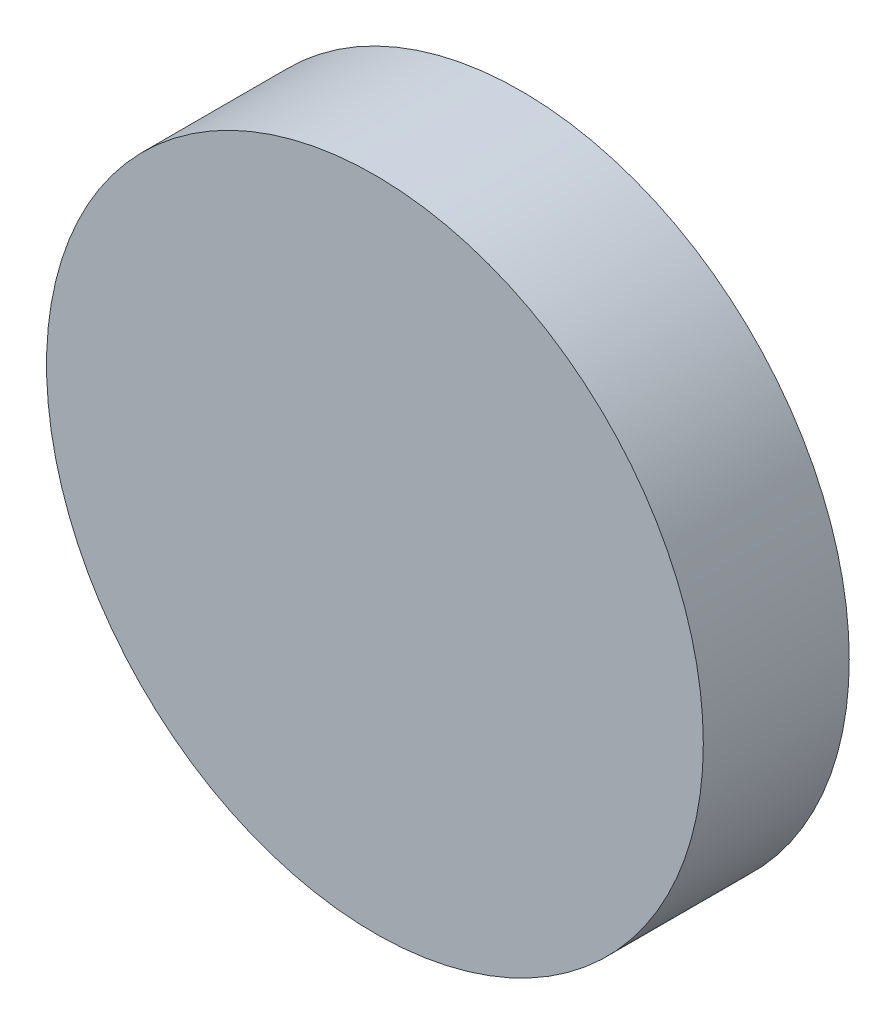
ISO-10303-21;
HEADER;
FILE_DESCRIPTION(('STEP AP214'),'2;1');
FILE_NAME('part.step','',(''),(''),'','','');
FILE_SCHEMA(('AUTOMOTIVE_DESIGN { 1 0 10303 214 1 1 1 1 }'));
ENDSEC;
DATA;
#1=APPLICATION_CONTEXT('core data for automotive mechanical design processes');
#2=APPLICATION_PROTOCOL_DEFINITION('international standard','automotive_design',2000,#1);
#3=PRODUCT_CONTEXT('',#1,'mechanical');
#4=PRODUCT('Part','Part','',(#3));
#5=PRODUCT_RELATED_PRODUCT_CATEGORY('part','',(#4));
#6=PRODUCT_DEFINITION_FORMATION('','',#4);
#7=PRODUCT_DEFINITION_CONTEXT('part definition',#1,'design');
#8=PRODUCT_DEFINITION('design','',#6,#7);
#9=PRODUCT_DEFINITION_SHAPE('','',#8);
#10=(LENGTH_UNIT() NAMED_UNIT(*) SI_UNIT(.MILLI.,.METRE.));
#11=(NAMED_UNIT(*) PLANE_ANGLE_UNIT() SI_UNIT($,.RADIAN.));
#12=(NAMED_UNIT(*) SI_UNIT($,.STERADIAN.) SOLID_ANGLE_UNIT());
#13=UNCERTAINTY_MEASURE_WITH_UNIT(LENGTH_MEASURE(1.E-05),#10,'distance_accuracy_value','');
#14=(GEOMETRIC_REPRESENTATION_CONTEXT(3) GLOBAL_UNCERTAINTY_ASSIGNED_CONTEXT((#13)) GLOBAL_UNIT_ASSIGNED_CONTEXT((#10,
#11,#12)) REPRESENTATION_CONTEXT('',''));
#15=CARTESIAN_POINT('',(0.,0.,0.));
#16=DIRECTION('',(0.,0.,1.));
#17=DIRECTION('',(1.,0.,0.));
#18=AXIS2_PLACEMENT_3D('',#15,#16,#17);
#19=CARTESIAN_POINT('',(0.,0.,4.));
#20=DIRECTION('',(0.,0.,-1.));
#21=DIRECTION('',(-1.,0.,0.));
#22=AXIS2_PLACEMENT_3D('',#19,#20,#21);
#23=CYLINDRICAL_SURFACE('',#22,9.);
#24=CARTESIAN_POINT('',(0.,0.,4.));
#25=DIRECTION('',(0.,0.,1.));
#26=DIRECTION('',(1.,0.,0.));
#27=AXIS2_PLACEMENT_3D('',#24,#25,#26);
#28=CIRCLE('',#27,9.);
#29=CARTESIAN_POINT('',(9.,0.,4.));
#30=VERTEX_POINT('',#29);
#31=EDGE_CURVE('E10',#30,#30,#28,.T.);
#32=ORIENTED_EDGE('',*,*,#31,.F.);
#33=EDGE_LOOP('',(#32));
#34=FACE_BOUND('',#33,.T.);
#35=CARTESIAN_POINT('',(0.,0.,0.));
#36=DIRECTION('',(0.,0.,1.));
#37=DIRECTION('',(1.,0.,0.));
#38=AXIS2_PLACEMENT_3D('',#35,#36,#37);
#39=CIRCLE('',#38,9.);
#40=CARTESIAN_POINT('',(9.,0.,0.));
#41=VERTEX_POINT('',#40);
#42=EDGE_CURVE('E40',#41,#41,#39,.T.);
#43=ORIENTED_EDGE('',*,*,#42,.T.);
#44=EDGE_LOOP('',(#43));
#45=FACE_BOUND('',#44,.T.);
#46=ADVANCED_FACE('F37',(#34,#45),#23,.T.);
#47=CARTESIAN_POINT('',(0.,0.,4.));
#48=DIRECTION('',(0.,0.,1.));
#49=DIRECTION('',(1.,0.,0.));
#50=AXIS2_PLACEMENT_3D('',#47,#48,#49);
#51=PLANE('',#50);
#52=ORIENTED_EDGE('',*,*,#31,.T.);
#53=EDGE_LOOP('',(#52));
#54=FACE_BOUND('',#53,.T.);
#55=ADVANCED_FACE('F52',(#54),#51,.T.);
#56=CARTESIAN_POINT('',(0.,0.,0.));
#57=DIRECTION('',(0.,0.,1.));
#58=DIRECTION('',(1.,0.,0.));
#59=AXIS2_PLACEMENT_3D('',#56,#57,#58);
#60=PLANE('',#59);
#61=ORIENTED_EDGE('',*,*,#42,.F.);
#62=EDGE_LOOP('',(#61));
#63=FACE_BOUND('',#62,.T.);
#64=ADVANCED_FACE('F50',(#63),#60,.F.);
#65=CLOSED_SHELL('',(#46,#55,#64));
#66=MANIFOLD_SOLID_BREP('B2',#65);
#67=ADVANCED_BREP_SHAPE_REPRESENTATION('',(#18,#66),#14);
#68=SHAPE_DEFINITION_REPRESENTATION(#9,#67);
ENDSEC;
END-ISO-10303-21;
